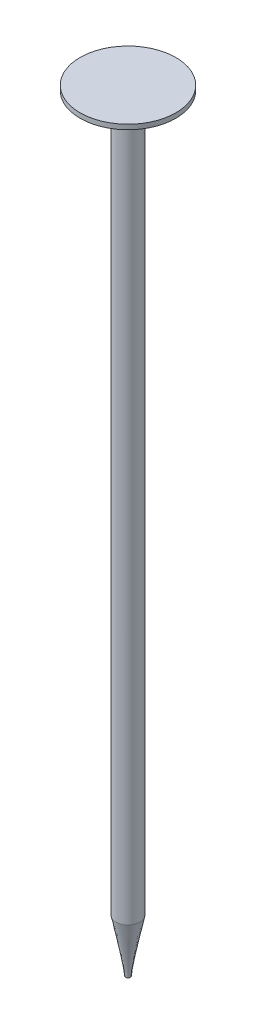
ISO-10303-21;
HEADER;
FILE_DESCRIPTION(('STEP AP214'),'2;1');
FILE_NAME('part.step','',(''),(''),'','','');
FILE_SCHEMA(('AUTOMOTIVE_DESIGN { 1 0 10303 214 1 1 1 1 }'));
ENDSEC;
DATA;
#1=APPLICATION_CONTEXT('core data for automotive mechanical design processes');
#2=APPLICATION_PROTOCOL_DEFINITION('international standard','automotive_design',2000,#1);
#3=PRODUCT_CONTEXT('',#1,'mechanical');
#4=PRODUCT('Part','Part','',(#3));
#5=PRODUCT_RELATED_PRODUCT_CATEGORY('part','',(#4));
#6=PRODUCT_DEFINITION_FORMATION('','',#4);
#7=PRODUCT_DEFINITION_CONTEXT('part definition',#1,'design');
#8=PRODUCT_DEFINITION('design','',#6,#7);
#9=PRODUCT_DEFINITION_SHAPE('','',#8);
#10=(LENGTH_UNIT() NAMED_UNIT(*) SI_UNIT(.MILLI.,.METRE.));
#11=(NAMED_UNIT(*) PLANE_ANGLE_UNIT() SI_UNIT($,.RADIAN.));
#12=(NAMED_UNIT(*) SI_UNIT($,.STERADIAN.) SOLID_ANGLE_UNIT());
#13=UNCERTAINTY_MEASURE_WITH_UNIT(LENGTH_MEASURE(1.E-05),#10,'distance_accuracy_value','');
#14=(GEOMETRIC_REPRESENTATION_CONTEXT(3) GLOBAL_UNCERTAINTY_ASSIGNED_CONTEXT((#13)) GLOBAL_UNIT_ASSIGNED_CONTEXT((#10,
#11,#12)) REPRESENTATION_CONTEXT('',''));
#15=CARTESIAN_POINT('',(0.,0.,0.));
#16=DIRECTION('',(0.,0.,1.));
#17=DIRECTION('',(1.,0.,0.));
#18=AXIS2_PLACEMENT_3D('',#15,#16,#17);
#19=CARTESIAN_POINT('',(0.,2.54,0.));
#20=DIRECTION('',(0.,-1.,0.));
#21=DIRECTION('',(0.,0.,-1.));
#22=AXIS2_PLACEMENT_3D('',#19,#20,#21);
#23=CYLINDRICAL_SURFACE('',#22,25.4);
#24=CARTESIAN_POINT('',(0.,2.54,0.));
#25=DIRECTION('',(0.,1.,0.));
#26=DIRECTION('',(0.,0.,1.));
#27=AXIS2_PLACEMENT_3D('',#24,#25,#26);
#28=CIRCLE('',#27,25.4);
#29=CARTESIAN_POINT('',(0.,2.54,25.4));
#30=VERTEX_POINT('',#29);
#31=EDGE_CURVE('E11',#30,#30,#28,.T.);
#32=ORIENTED_EDGE('',*,*,#31,.F.);
#33=EDGE_LOOP('',(#32));
#34=FACE_BOUND('',#33,.T.);
#35=CARTESIAN_POINT('',(0.,0.,0.));
#36=DIRECTION('',(0.,1.,0.));
#37=DIRECTION('',(0.,0.,1.));
#38=AXIS2_PLACEMENT_3D('',#35,#36,#37);
#39=CIRCLE('',#38,25.4);
#40=CARTESIAN_POINT('',(0.,0.,25.4));
#41=VERTEX_POINT('',#40);
#42=EDGE_CURVE('E48',#41,#41,#39,.T.);
#43=ORIENTED_EDGE('',*,*,#42,.T.);
#44=EDGE_LOOP('',(#43));
#45=FACE_BOUND('',#44,.T.);
#46=ADVANCED_FACE('F41',(#34,#45),#23,.T.);
#47=CARTESIAN_POINT('',(0.,2.54,0.));
#48=DIRECTION('',(0.,1.,0.));
#49=DIRECTION('',(0.,0.,1.));
#50=AXIS2_PLACEMENT_3D('',#47,#48,#49);
#51=PLANE('',#50);
#52=ORIENTED_EDGE('',*,*,#31,.T.);
#53=EDGE_LOOP('',(#52));
#54=FACE_BOUND('',#53,.T.);
#55=ADVANCED_FACE('F113',(#54),#51,.T.);
#56=CARTESIAN_POINT('',(0.,0.,0.));
#57=DIRECTION('',(0.,1.,0.));
#58=DIRECTION('',(0.,0.,1.));
#59=AXIS2_PLACEMENT_3D('',#56,#57,#58);
#60=PLANE('',#59);
#61=CARTESIAN_POINT('',(0.,0.,0.));
#62=DIRECTION('',(0.,1.,0.));
#63=DIRECTION('',(0.,0.,1.));
#64=AXIS2_PLACEMENT_3D('',#61,#62,#63);
#65=CIRCLE('',#64,6.35);
#66=CARTESIAN_POINT('',(0.,0.,6.35));
#67=VERTEX_POINT('',#66);
#68=EDGE_CURVE('E44',#67,#67,#65,.T.);
#69=ORIENTED_EDGE('',*,*,#68,.T.);
#70=EDGE_LOOP('',(#69));
#71=FACE_BOUND('',#70,.T.);
#72=ORIENTED_EDGE('',*,*,#42,.F.);
#73=EDGE_LOOP('',(#72));
#74=FACE_BOUND('',#73,.T.);
#75=ADVANCED_FACE('F105',(#71,#74),#60,.F.);
#76=CARTESIAN_POINT('',(0.,-378.46,0.));
#77=DIRECTION('',(0.,1.,0.));
#78=DIRECTION('',(0.,0.,1.));
#79=AXIS2_PLACEMENT_3D('',#76,#77,#78);
#80=CYLINDRICAL_SURFACE('',#79,6.35);
#81=CARTESIAN_POINT('',(0.,-378.46,0.));
#82=DIRECTION('',(0.,1.,0.));
#83=DIRECTION('',(0.,0.,1.));
#84=AXIS2_PLACEMENT_3D('',#81,#82,#83);
#85=CIRCLE('',#84,6.35);
#86=CARTESIAN_POINT('',(4.91304286487444,-378.46,-4.02299761470304));
#87=VERTEX_POINT('',#86);
#88=EDGE_CURVE('E59',#87,#87,#85,.F.);
#89=ORIENTED_EDGE('',*,*,#88,.F.);
#90=EDGE_LOOP('',(#89));
#91=FACE_BOUND('',#90,.T.);
#92=ORIENTED_EDGE('',*,*,#68,.F.);
#93=EDGE_LOOP('',(#92));
#94=FACE_BOUND('',#93,.T.);
#95=ADVANCED_FACE('F76',(#91,#94),#80,.T.);
#96=CARTESIAN_POINT('',(0.,-406.4,0.));
#97=DIRECTION('',(0.,1.,0.));
#98=DIRECTION('',(0.,0.,1.));
#99=AXIS2_PLACEMENT_3D('',#96,#97,#98);
#100=PLANE('',#99);
#101=CARTESIAN_POINT('',(0.,-406.4,0.));
#102=DIRECTION('',(0.,1.,0.));
#103=DIRECTION('',(0.,0.,1.));
#104=AXIS2_PLACEMENT_3D('',#101,#102,#103);
#105=CIRCLE('',#104,1.27);
#106=CARTESIAN_POINT('',(-0.252067696244799,-406.4,-1.24473365685589));
#107=VERTEX_POINT('',#106);
#108=EDGE_CURVE('E56',#107,#107,#105,.T.);
#109=ORIENTED_EDGE('',*,*,#108,.F.);
#110=EDGE_LOOP('',(#109));
#111=FACE_BOUND('',#110,.T.);
#112=ADVANCED_FACE('F66',(#111),#100,.F.);
#113=CARTESIAN_POINT('',(4.91304286487444,-378.46,-4.02299761470304));
#114=CARTESIAN_POINT('',(-0.252067696244799,-406.4,-1.24473365685589));
#115=CARTESIAN_POINT('',(12.9590380942805,-378.46,5.80308811504585));
#116=CARTESIAN_POINT('',(2.23739961746698,-406.4,-1.74886904934549));
#117=CARTESIAN_POINT('',(3.13295236453163,-378.46,13.8490833444519));
#118=CARTESIAN_POINT('',(2.74153500995658,-406.4,0.740598264366293));
#119=CARTESIAN_POINT('',(-4.91304286487444,-378.46,4.02299761470304));
#120=CARTESIAN_POINT('',(0.252067696244799,-406.4,1.24473365685589));
#121=CARTESIAN_POINT('',(-12.9590380942805,-378.46,-5.80308811504585));
#122=CARTESIAN_POINT('',(-2.23739961746698,-406.4,1.74886904934549));
#123=CARTESIAN_POINT('',(-3.13295236453163,-378.46,-13.8490833444519));
#124=CARTESIAN_POINT('',(-2.74153500995658,-406.4,-0.740598264366293));
#125=CARTESIAN_POINT('',(4.91304286487444,-378.46,-4.02299761470304));
#126=CARTESIAN_POINT('',(-0.252067696244799,-406.4,-1.24473365685589));
#127=(BOUNDED_SURFACE() B_SPLINE_SURFACE(3,1,((#113,#114),(#115,#116),(#117,#118),(#119,#120),
(#121,#122),(#123,#124),(#125,#126)),.UNSPECIFIED.,.T.,.F.,.F.) B_SPLINE_SURFACE_WITH_KNOTS((4,
3,4),(2,2),(0.,0.5,1.),(0.,1.),
.UNSPECIFIED.) GEOMETRIC_REPRESENTATION_ITEM() RATIONAL_B_SPLINE_SURFACE(((1.,1.),
(0.333333333333333,0.333333333333333),(0.333333333333333,0.333333333333333),(1.,1.),
(0.333333333333333,0.333333333333333),(0.333333333333333,0.333333333333333),(1.,1.))) REPRESENTATION_ITEM('') SURFACE());
#128=CARTESIAN_POINT('',(4.91304286487444,-378.46,-4.02299761470304));
#129=CARTESIAN_POINT('',(4.85923962986278,-378.751041666667,-3.99405736514213));
#130=CARTESIAN_POINT('',(4.80543639485113,-379.042083333333,-3.96511711558122));
#131=CARTESIAN_POINT('',(4.69782992482781,-379.624166666667,-3.90723661645941));
#132=CARTESIAN_POINT('',(4.64402668981615,-379.915208333333,-3.8782963668985));
#133=CARTESIAN_POINT('',(4.53642021979283,-380.497291666667,-3.82041586777668));
#134=CARTESIAN_POINT('',(4.48261698478117,-380.788333333333,-3.79147561821577));
#135=CARTESIAN_POINT('',(4.37501051475786,-381.370416666667,-3.73359511909396));
#136=CARTESIAN_POINT('',(4.3212072797462,-381.661458333333,-3.70465486953305));
#137=CARTESIAN_POINT('',(4.21360080972288,-382.243541666667,-3.64677437041124));
#138=CARTESIAN_POINT('',(4.15979757471122,-382.534583333333,-3.61783412085033));
#139=CARTESIAN_POINT('',(4.0521911046879,-383.116666666667,-3.55995362172851));
#140=CARTESIAN_POINT('',(3.99838786967625,-383.407708333333,-3.53101337216761));
#141=CARTESIAN_POINT('',(3.89078139965293,-383.989791666667,-3.47313287304579));
#142=CARTESIAN_POINT('',(3.83697816464127,-384.280833333333,-3.44419262348488));
#143=CARTESIAN_POINT('',(3.72937169461795,-384.862916666667,-3.38631212436306));
#144=CARTESIAN_POINT('',(3.67556845960629,-385.153958333333,-3.35737187480216));
#145=CARTESIAN_POINT('',(3.56796198958298,-385.736041666667,-3.29949137568034));
#146=CARTESIAN_POINT('',(3.51415875457132,-386.027083333333,-3.27055112611944));
#147=CARTESIAN_POINT('',(3.406552284548,-386.609166666667,-3.21267062699762));
#148=CARTESIAN_POINT('',(3.35274904953634,-386.900208333333,-3.18373037743671));
#149=CARTESIAN_POINT('',(3.24514257951302,-387.482291666667,-3.1258498783149));
#150=CARTESIAN_POINT('',(3.19133934450136,-387.773333333333,-3.09690962875399));
#151=CARTESIAN_POINT('',(3.08373287447805,-388.355416666667,-3.03902912963217));
#152=CARTESIAN_POINT('',(3.02992963946639,-388.646458333333,-3.01008888007127));
#153=CARTESIAN_POINT('',(2.92232316944307,-389.228541666667,-2.95220838094945));
#154=CARTESIAN_POINT('',(2.86851993443141,-389.519583333333,-2.92326813138854));
#155=CARTESIAN_POINT('',(2.76091346440809,-390.101666666667,-2.86538763226672));
#156=CARTESIAN_POINT('',(2.70711022939643,-390.392708333333,-2.83644738270582));
#157=CARTESIAN_POINT('',(2.59950375937312,-390.974791666667,-2.778566883584));
#158=CARTESIAN_POINT('',(2.54570052436146,-391.265833333333,-2.7496266340231));
#159=CARTESIAN_POINT('',(2.43809405433814,-391.847916666667,-2.69174613490128));
#160=CARTESIAN_POINT('',(2.38429081932648,-392.138958333333,-2.66280588534037));
#161=CARTESIAN_POINT('',(2.27668434930316,-392.721041666667,-2.60492538621856));
#162=CARTESIAN_POINT('',(2.2228811142915,-393.012083333333,-2.57598513665765));
#163=CARTESIAN_POINT('',(2.11527464426819,-393.594166666667,-2.51810463753583));
#164=CARTESIAN_POINT('',(2.06147140925653,-393.885208333333,-2.48916438797492));
#165=CARTESIAN_POINT('',(1.95386493923321,-394.467291666667,-2.43128388885311));
#166=CARTESIAN_POINT('',(1.90006170422155,-394.758333333333,-2.4023436392922));
#167=CARTESIAN_POINT('',(1.79245523419824,-395.340416666667,-2.34446314017039));
#168=CARTESIAN_POINT('',(1.73865199918658,-395.631458333333,-2.31552289060948));
#169=CARTESIAN_POINT('',(1.63104552916326,-396.213541666667,-2.25764239148766));
#170=CARTESIAN_POINT('',(1.5772422941516,-396.504583333333,-2.22870214192675));
#171=CARTESIAN_POINT('',(1.46963582412828,-397.086666666667,-2.17082164280494));
#172=CARTESIAN_POINT('',(1.41583258911662,-397.377708333333,-2.14188139324403));
#173=CARTESIAN_POINT('',(1.30822611909331,-397.959791666667,-2.08400089412222));
#174=CARTESIAN_POINT('',(1.25442288408165,-398.250833333333,-2.05506064456131));
#175=CARTESIAN_POINT('',(1.14681641405833,-398.832916666667,-1.99718014543949));
#176=CARTESIAN_POINT('',(1.09301317904667,-399.123958333333,-1.96823989587858));
#177=CARTESIAN_POINT('',(0.985406709023351,-399.706041666667,-1.91035939675677));
#178=CARTESIAN_POINT('',(0.931603474011693,-399.997083333333,-1.88141914719586));
#179=CARTESIAN_POINT('',(0.823997003988377,-400.579166666667,-1.82353864807405));
#180=CARTESIAN_POINT('',(0.77019376897672,-400.870208333333,-1.79459839851314));
#181=CARTESIAN_POINT('',(0.662587298953402,-401.452291666667,-1.73671789939132));
#182=CARTESIAN_POINT('',(0.608784063941741,-401.743333333333,-1.70777764983042));
#183=CARTESIAN_POINT('',(0.501177593918424,-402.325416666667,-1.6498971507086));
#184=CARTESIAN_POINT('',(0.447374358906766,-402.616458333333,-1.62095690114769));
#185=CARTESIAN_POINT('',(0.339767888883446,-403.198541666667,-1.56307640202588));
#186=CARTESIAN_POINT('',(0.285964653871785,-403.489583333333,-1.53413615246497));
#187=CARTESIAN_POINT('',(0.178358183848469,-404.071666666667,-1.47625565334315));
#188=CARTESIAN_POINT('',(0.124554948836814,-404.362708333333,-1.44731540378225));
#189=CARTESIAN_POINT('',(0.0169484788134993,-404.944791666667,-1.38943490466043));
#190=CARTESIAN_POINT('',(-0.0368547561981617,-405.235833333333,-1.36049465509952));
#191=CARTESIAN_POINT('',(-0.144461226221484,-405.817916666667,-1.30261415597771));
#192=CARTESIAN_POINT('',(-0.198264461233145,-406.108958333333,-1.2736739064168));
#193=CARTESIAN_POINT('',(-0.252067696244799,-406.4,-1.24473365685589));
#194=B_SPLINE_CURVE_WITH_KNOTS('',3,(#128,#129,#130,#131,#132,#133,#134,#135,#136,#137,#138,
#139,#140,#141,#142,#143,#144,#145,#146,#147,#148,#149,#150,#151,#152,#153,#154,#155,#156,#157,
#158,#159,#160,#161,#162,#163,#164,#165,#166,#167,#168,#169,#170,#171,#172,#173,#174,#175,#176,
#177,#178,#179,#180,#181,#182,#183,#184,#185,#186,#187,#188,#189,#190,#191,#192,#193),
.UNSPECIFIED.,.F.,.F.,(4,2,2,2,2,2,2,2,2,2,2,2,2,2,2,2,2,2,2,2,2,2,2,2,2,2,2,2,2,2,2,2,4),(0.,
0.892153686819856,1.78430737363971,2.67646106045962,3.56861474727953,4.46076843409939,
5.3529221209193,6.24507580773916,7.13722949455907,8.02938318137893,8.92153686819878,
9.81369055501869,10.7058442418385,11.5979979286584,12.4901516154783,13.3823053022982,
14.2744589891181,15.1666126759379,16.0587663627579,16.9509200495778,17.8430737363976,
18.7352274232175,19.6273811100374,20.5195347968572,21.4116884836771,22.303842170497,
23.1959958573169,24.0881495441368,24.9803032309566,25.8724569177765,26.7646106045965,
27.6567642914163,28.5489179782362),.UNSPECIFIED.);
#195=EDGE_CURVE('BSEAM75',#87,#107,#194,.T.);
#196=ORIENTED_EDGE('',*,*,#88,.T.);
#197=ORIENTED_EDGE('',*,*,#108,.T.);
#198=ORIENTED_EDGE('',*,*,#195,.T.);
#199=ORIENTED_EDGE('',*,*,#195,.F.);
#200=EDGE_LOOP('',(#196,#198,#197,#199));
#201=FACE_BOUND('',#200,.T.);
#202=ADVANCED_FACE('F75',(#201),#127,.T.);
#203=CLOSED_SHELL('',(#46,#55,#75,#95,#112,#202));
#204=MANIFOLD_SOLID_BREP('B2',#203);
#205=ADVANCED_BREP_SHAPE_REPRESENTATION('',(#18,#204),#14);
#206=SHAPE_DEFINITION_REPRESENTATION(#9,#205);
ENDSEC;
END-ISO-10303-21;
